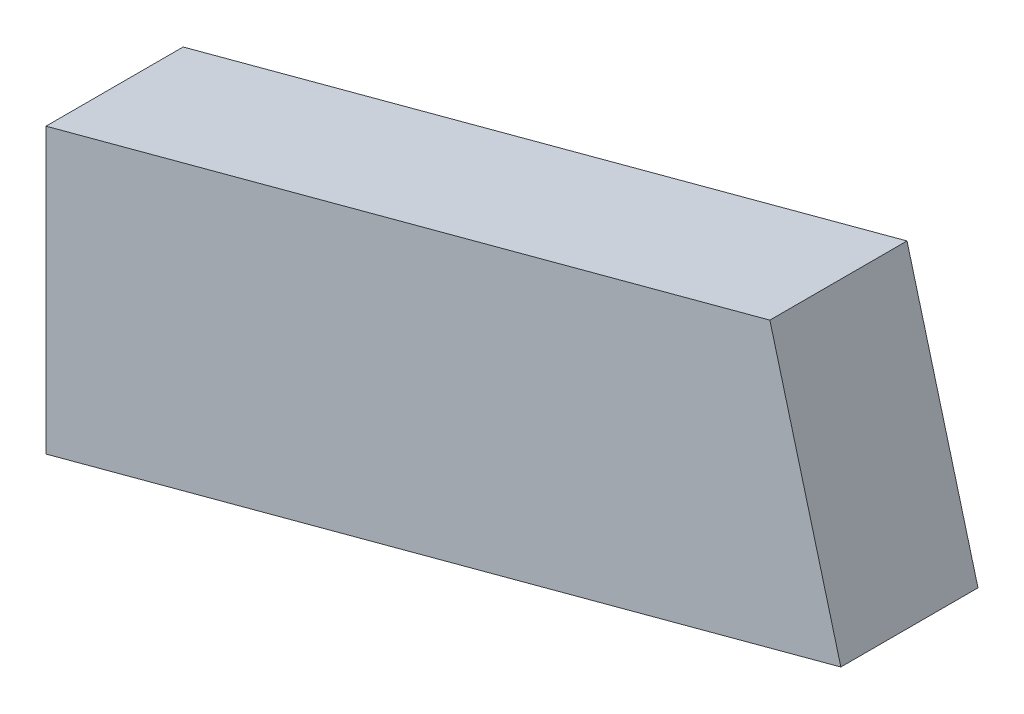
ISO-10303-21;
HEADER;
FILE_DESCRIPTION(('STEP AP214'),'2;1');
FILE_NAME('part.step','',(''),(''),'','','');
FILE_SCHEMA(('AUTOMOTIVE_DESIGN { 1 0 10303 214 1 1 1 1 }'));
ENDSEC;
DATA;
#1=APPLICATION_CONTEXT('core data for automotive mechanical design processes');
#2=APPLICATION_PROTOCOL_DEFINITION('international standard','automotive_design',2000,#1);
#3=PRODUCT_CONTEXT('',#1,'mechanical');
#4=PRODUCT('Part','Part','',(#3));
#5=PRODUCT_RELATED_PRODUCT_CATEGORY('part','',(#4));
#6=PRODUCT_DEFINITION_FORMATION('','',#4);
#7=PRODUCT_DEFINITION_CONTEXT('part definition',#1,'design');
#8=PRODUCT_DEFINITION('design','',#6,#7);
#9=PRODUCT_DEFINITION_SHAPE('','',#8);
#10=(LENGTH_UNIT() NAMED_UNIT(*) SI_UNIT(.MILLI.,.METRE.));
#11=(NAMED_UNIT(*) PLANE_ANGLE_UNIT() SI_UNIT($,.RADIAN.));
#12=(NAMED_UNIT(*) SI_UNIT($,.STERADIAN.) SOLID_ANGLE_UNIT());
#13=UNCERTAINTY_MEASURE_WITH_UNIT(LENGTH_MEASURE(1.E-05),#10,'distance_accuracy_value','');
#14=(GEOMETRIC_REPRESENTATION_CONTEXT(3) GLOBAL_UNCERTAINTY_ASSIGNED_CONTEXT((#13)) GLOBAL_UNIT_ASSIGNED_CONTEXT((#10,
#11,#12)) REPRESENTATION_CONTEXT('',''));
#15=CARTESIAN_POINT('',(0.,0.,0.));
#16=DIRECTION('',(0.,0.,1.));
#17=DIRECTION('',(1.,0.,0.));
#18=AXIS2_PLACEMENT_3D('',#15,#16,#17);
#19=CARTESIAN_POINT('',(-13.012744606334,43.7728708450438,12.7));
#20=DIRECTION('',(-0.258819045102525,0.965925826289067,0.));
#21=DIRECTION('',(-0.965925826289067,-0.258819045102525,0.));
#22=AXIS2_PLACEMENT_3D('',#19,#20,#21);
#23=PLANE('',#22);
#24=DIRECTION('',(0.965925826289067,0.258819045102525,0.));
#25=VECTOR('',#24,1.);
#26=CARTESIAN_POINT('',(-13.012744606334,43.7728708450438,0.));
#27=LINE('',#26,#25);
#28=CARTESIAN_POINT('',(-13.012744606334,43.7728708450438,0.));
#29=VERTEX_POINT('',#28);
#30=CARTESIAN_POINT('',(54.0167996112888,61.7333830871823,0.));
#31=VERTEX_POINT('',#30);
#32=EDGE_CURVE('E110',#29,#31,#27,.T.);
#33=ORIENTED_EDGE('',*,*,#32,.F.);
#34=DIRECTION('',(0.,0.,-1.));
#35=VECTOR('',#34,1.);
#36=CARTESIAN_POINT('',(-13.012744606334,43.7728708450438,12.7));
#37=LINE('',#36,#35);
#38=CARTESIAN_POINT('',(-13.012744606334,43.7728708450438,12.7));
#39=VERTEX_POINT('',#38);
#40=EDGE_CURVE('E11',#39,#29,#37,.T.);
#41=ORIENTED_EDGE('',*,*,#40,.F.);
#42=DIRECTION('',(0.965925826289067,0.258819045102525,0.));
#43=VECTOR('',#42,1.);
#44=CARTESIAN_POINT('',(-13.012744606334,43.7728708450438,12.7));
#45=LINE('',#44,#43);
#46=CARTESIAN_POINT('',(54.0167996112888,61.7333830871823,12.7));
#47=VERTEX_POINT('',#46);
#48=EDGE_CURVE('E102',#39,#47,#45,.T.);
#49=ORIENTED_EDGE('',*,*,#48,.T.);
#50=DIRECTION('',(0.,0.,-1.));
#51=VECTOR('',#50,1.);
#52=CARTESIAN_POINT('',(54.0167996112888,61.7333830871823,12.7));
#53=LINE('',#52,#51);
#54=EDGE_CURVE('E42',#47,#31,#53,.T.);
#55=ORIENTED_EDGE('',*,*,#54,.T.);
#56=EDGE_LOOP('',(#33,#41,#49,#55));
#57=FACE_BOUND('',#56,.T.);
#58=ADVANCED_FACE('F39',(#57),#23,.T.);
#59=CARTESIAN_POINT('',(-13.012744606334,43.7728708450438,12.7));
#60=DIRECTION('',(1.,0.,0.));
#61=DIRECTION('',(0.,1.,0.));
#62=AXIS2_PLACEMENT_3D('',#59,#60,#61);
#63=PLANE('',#62);
#64=DIRECTION('',(0.,-1.,0.));
#65=VECTOR('',#64,1.);
#66=CARTESIAN_POINT('',(-13.012744606334,43.7728708450438,0.));
#67=LINE('',#66,#65);
#68=CARTESIAN_POINT('',(-13.012744606334,17.4768558626276,0.));
#69=VERTEX_POINT('',#68);
#70=EDGE_CURVE('E105',#29,#69,#67,.T.);
#71=ORIENTED_EDGE('',*,*,#70,.T.);
#72=DIRECTION('',(0.,0.,-1.));
#73=VECTOR('',#72,1.);
#74=CARTESIAN_POINT('',(-13.012744606334,17.4768558626276,12.7));
#75=LINE('',#74,#73);
#76=CARTESIAN_POINT('',(-13.012744606334,17.4768558626276,12.7));
#77=VERTEX_POINT('',#76);
#78=EDGE_CURVE('E49',#77,#69,#75,.T.);
#79=ORIENTED_EDGE('',*,*,#78,.F.);
#80=DIRECTION('',(0.,-1.,0.));
#81=VECTOR('',#80,1.);
#82=CARTESIAN_POINT('',(-13.012744606334,43.7728708450438,12.7));
#83=LINE('',#82,#81);
#84=EDGE_CURVE('E97',#39,#77,#83,.T.);
#85=ORIENTED_EDGE('',*,*,#84,.F.);
#86=ORIENTED_EDGE('',*,*,#40,.T.);
#87=EDGE_LOOP('',(#71,#79,#85,#86));
#88=FACE_BOUND('',#87,.T.);
#89=ADVANCED_FACE('F125',(#88),#63,.F.);
#90=CARTESIAN_POINT('',(60.5908033568929,37.19886709944,12.7));
#91=DIRECTION('',(0.258819045102525,-0.965925826289067,0.));
#92=DIRECTION('',(0.965925826289067,0.258819045102525,0.));
#93=AXIS2_PLACEMENT_3D('',#90,#91,#92);
#94=PLANE('',#93);
#95=DIRECTION('',(-0.965925826289067,-0.258819045102525,0.));
#96=VECTOR('',#95,1.);
#97=CARTESIAN_POINT('',(60.5908033568929,37.19886709944,0.));
#98=LINE('',#97,#96);
#99=CARTESIAN_POINT('',(60.5908033568929,37.19886709944,0.));
#100=VERTEX_POINT('',#99);
#101=EDGE_CURVE('E90',#100,#69,#98,.T.);
#102=ORIENTED_EDGE('',*,*,#101,.F.);
#103=DIRECTION('',(0.,0.,-1.));
#104=VECTOR('',#103,1.);
#105=CARTESIAN_POINT('',(60.5908033568929,37.19886709944,12.7));
#106=LINE('',#105,#104);
#107=CARTESIAN_POINT('',(60.5908033568929,37.19886709944,12.7));
#108=VERTEX_POINT('',#107);
#109=EDGE_CURVE('E85',#108,#100,#106,.T.);
#110=ORIENTED_EDGE('',*,*,#109,.F.);
#111=DIRECTION('',(-0.965925826289067,-0.258819045102525,0.));
#112=VECTOR('',#111,1.);
#113=CARTESIAN_POINT('',(60.5908033568929,37.19886709944,12.7));
#114=LINE('',#113,#112);
#115=EDGE_CURVE('E88',#108,#77,#114,.T.);
#116=ORIENTED_EDGE('',*,*,#115,.T.);
#117=ORIENTED_EDGE('',*,*,#78,.T.);
#118=EDGE_LOOP('',(#102,#110,#116,#117));
#119=FACE_BOUND('',#118,.T.);
#120=ADVANCED_FACE('F87',(#119),#94,.T.);
#121=CARTESIAN_POINT('',(54.0167996112888,61.7333830871823,12.7));
#122=DIRECTION('',(0.965925826289067,0.258819045102525,0.));
#123=DIRECTION('',(-0.258819045102525,0.965925826289067,0.));
#124=AXIS2_PLACEMENT_3D('',#121,#122,#123);
#125=PLANE('',#124);
#126=DIRECTION('',(0.258819045102525,-0.965925826289067,0.));
#127=VECTOR('',#126,1.);
#128=CARTESIAN_POINT('',(54.0167996112888,61.7333830871823,0.));
#129=LINE('',#128,#127);
#130=EDGE_CURVE('E114',#31,#100,#129,.T.);
#131=ORIENTED_EDGE('',*,*,#130,.F.);
#132=ORIENTED_EDGE('',*,*,#54,.F.);
#133=DIRECTION('',(0.258819045102525,-0.965925826289067,0.));
#134=VECTOR('',#133,1.);
#135=CARTESIAN_POINT('',(54.0167996112888,61.7333830871823,12.7));
#136=LINE('',#135,#134);
#137=EDGE_CURVE('E96',#47,#108,#136,.T.);
#138=ORIENTED_EDGE('',*,*,#137,.T.);
#139=ORIENTED_EDGE('',*,*,#109,.T.);
#140=EDGE_LOOP('',(#131,#132,#138,#139));
#141=FACE_BOUND('',#140,.T.);
#142=ADVANCED_FACE('F100',(#141),#125,.T.);
#143=CARTESIAN_POINT('',(0.,0.,12.7));
#144=DIRECTION('',(0.,0.,-1.));
#145=DIRECTION('',(-1.,0.,0.));
#146=AXIS2_PLACEMENT_3D('',#143,#144,#145);
#147=PLANE('',#146);
#148=ORIENTED_EDGE('',*,*,#48,.F.);
#149=ORIENTED_EDGE('',*,*,#84,.T.);
#150=ORIENTED_EDGE('',*,*,#115,.F.);
#151=ORIENTED_EDGE('',*,*,#137,.F.);
#152=EDGE_LOOP('',(#148,#149,#150,#151));
#153=FACE_BOUND('',#152,.T.);
#154=ADVANCED_FACE('F95',(#153),#147,.F.);
#155=CARTESIAN_POINT('',(0.,0.,0.));
#156=DIRECTION('',(0.,0.,-1.));
#157=DIRECTION('',(-1.,0.,0.));
#158=AXIS2_PLACEMENT_3D('',#155,#156,#157);
#159=PLANE('',#158);
#160=ORIENTED_EDGE('',*,*,#32,.T.);
#161=ORIENTED_EDGE('',*,*,#130,.T.);
#162=ORIENTED_EDGE('',*,*,#101,.T.);
#163=ORIENTED_EDGE('',*,*,#70,.F.);
#164=EDGE_LOOP('',(#160,#161,#162,#163));
#165=FACE_BOUND('',#164,.T.);
#166=ADVANCED_FACE('F124',(#165),#159,.T.);
#167=CLOSED_SHELL('',(#58,#89,#120,#142,#154,#166));
#168=MANIFOLD_SOLID_BREP('B2',#167);
#169=ADVANCED_BREP_SHAPE_REPRESENTATION('',(#18,#168),#14);
#170=SHAPE_DEFINITION_REPRESENTATION(#9,#169);
ENDSEC;
END-ISO-10303-21;
